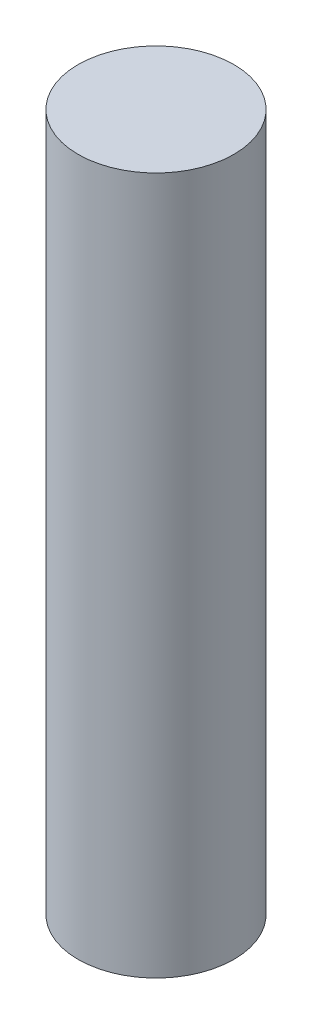
ISO-10303-21;
HEADER;
FILE_DESCRIPTION(('STEP AP214'),'2;1');
FILE_NAME('part.step','',(''),(''),'','','');
FILE_SCHEMA(('AUTOMOTIVE_DESIGN { 1 0 10303 214 1 1 1 1 }'));
ENDSEC;
DATA;
#1=APPLICATION_CONTEXT('core data for automotive mechanical design processes');
#2=APPLICATION_PROTOCOL_DEFINITION('international standard','automotive_design',2000,#1);
#3=PRODUCT_CONTEXT('',#1,'mechanical');
#4=PRODUCT('Part','Part','',(#3));
#5=PRODUCT_RELATED_PRODUCT_CATEGORY('part','',(#4));
#6=PRODUCT_DEFINITION_FORMATION('','',#4);
#7=PRODUCT_DEFINITION_CONTEXT('part definition',#1,'design');
#8=PRODUCT_DEFINITION('design','',#6,#7);
#9=PRODUCT_DEFINITION_SHAPE('','',#8);
#10=(LENGTH_UNIT() NAMED_UNIT(*) SI_UNIT(.MILLI.,.METRE.));
#11=(NAMED_UNIT(*) PLANE_ANGLE_UNIT() SI_UNIT($,.RADIAN.));
#12=(NAMED_UNIT(*) SI_UNIT($,.STERADIAN.) SOLID_ANGLE_UNIT());
#13=UNCERTAINTY_MEASURE_WITH_UNIT(LENGTH_MEASURE(1.E-05),#10,'distance_accuracy_value','');
#14=(GEOMETRIC_REPRESENTATION_CONTEXT(3) GLOBAL_UNCERTAINTY_ASSIGNED_CONTEXT((#13)) GLOBAL_UNIT_ASSIGNED_CONTEXT((#10,
#11,#12)) REPRESENTATION_CONTEXT('',''));
#15=CARTESIAN_POINT('',(0.,0.,0.));
#16=DIRECTION('',(0.,0.,1.));
#17=DIRECTION('',(1.,0.,0.));
#18=AXIS2_PLACEMENT_3D('',#15,#16,#17);
#19=CARTESIAN_POINT('',(0.,30.,0.));
#20=DIRECTION('',(0.,-1.,0.));
#21=DIRECTION('',(0.,0.,-1.));
#22=AXIS2_PLACEMENT_3D('',#19,#20,#21);
#23=CYLINDRICAL_SURFACE('',#22,3.35);
#24=CARTESIAN_POINT('',(0.,30.,0.));
#25=DIRECTION('',(0.,1.,0.));
#26=DIRECTION('',(0.,0.,1.));
#27=AXIS2_PLACEMENT_3D('',#24,#25,#26);
#28=CIRCLE('',#27,3.35);
#29=CARTESIAN_POINT('',(0.,30.,3.35));
#30=VERTEX_POINT('',#29);
#31=EDGE_CURVE('E10',#30,#30,#28,.T.);
#32=ORIENTED_EDGE('',*,*,#31,.F.);
#33=EDGE_LOOP('',(#32));
#34=FACE_BOUND('',#33,.T.);
#35=CARTESIAN_POINT('',(0.,0.,0.));
#36=DIRECTION('',(0.,1.,0.));
#37=DIRECTION('',(0.,0.,1.));
#38=AXIS2_PLACEMENT_3D('',#35,#36,#37);
#39=CIRCLE('',#38,3.35);
#40=CARTESIAN_POINT('',(0.,0.,3.35));
#41=VERTEX_POINT('',#40);
#42=EDGE_CURVE('E42',#41,#41,#39,.T.);
#43=ORIENTED_EDGE('',*,*,#42,.T.);
#44=EDGE_LOOP('',(#43));
#45=FACE_BOUND('',#44,.T.);
#46=ADVANCED_FACE('F39',(#34,#45),#23,.T.);
#47=CARTESIAN_POINT('',(0.,30.,0.));
#48=DIRECTION('',(0.,1.,0.));
#49=DIRECTION('',(0.,0.,1.));
#50=AXIS2_PLACEMENT_3D('',#47,#48,#49);
#51=PLANE('',#50);
#52=ORIENTED_EDGE('',*,*,#31,.T.);
#53=EDGE_LOOP('',(#52));
#54=FACE_BOUND('',#53,.T.);
#55=ADVANCED_FACE('F54',(#54),#51,.T.);
#56=CARTESIAN_POINT('',(0.,0.,0.));
#57=DIRECTION('',(0.,1.,0.));
#58=DIRECTION('',(0.,0.,1.));
#59=AXIS2_PLACEMENT_3D('',#56,#57,#58);
#60=PLANE('',#59);
#61=ORIENTED_EDGE('',*,*,#42,.F.);
#62=EDGE_LOOP('',(#61));
#63=FACE_BOUND('',#62,.T.);
#64=ADVANCED_FACE('F52',(#63),#60,.F.);
#65=CLOSED_SHELL('',(#46,#55,#64));
#66=MANIFOLD_SOLID_BREP('B2',#65);
#67=ADVANCED_BREP_SHAPE_REPRESENTATION('',(#18,#66),#14);
#68=SHAPE_DEFINITION_REPRESENTATION(#9,#67);
ENDSEC;
END-ISO-10303-21;
